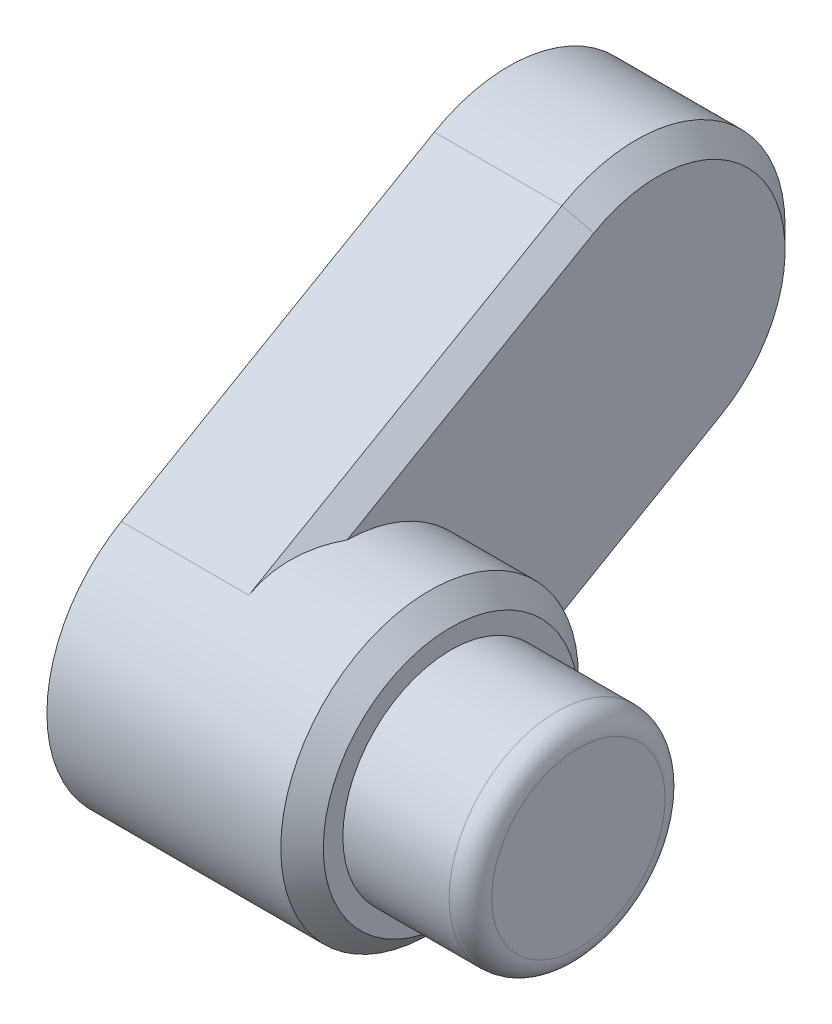
ISO-10303-21;
HEADER;
FILE_DESCRIPTION(('STEP AP214'),'2;1');
FILE_NAME('part.step','',(''),(''),'','','');
FILE_SCHEMA(('AUTOMOTIVE_DESIGN { 1 0 10303 214 1 1 1 1 }'));
ENDSEC;
DATA;
#1=APPLICATION_CONTEXT('core data for automotive mechanical design processes');
#2=APPLICATION_PROTOCOL_DEFINITION('international standard','automotive_design',2000,#1);
#3=PRODUCT_CONTEXT('',#1,'mechanical');
#4=PRODUCT('Part','Part','',(#3));
#5=PRODUCT_RELATED_PRODUCT_CATEGORY('part','',(#4));
#6=PRODUCT_DEFINITION_FORMATION('','',#4);
#7=PRODUCT_DEFINITION_CONTEXT('part definition',#1,'design');
#8=PRODUCT_DEFINITION('design','',#6,#7);
#9=PRODUCT_DEFINITION_SHAPE('','',#8);
#10=(LENGTH_UNIT() NAMED_UNIT(*) SI_UNIT(.MILLI.,.METRE.));
#11=(NAMED_UNIT(*) PLANE_ANGLE_UNIT() SI_UNIT($,.RADIAN.));
#12=(NAMED_UNIT(*) SI_UNIT($,.STERADIAN.) SOLID_ANGLE_UNIT());
#13=UNCERTAINTY_MEASURE_WITH_UNIT(LENGTH_MEASURE(1.E-05),#10,'distance_accuracy_value','');
#14=(GEOMETRIC_REPRESENTATION_CONTEXT(3) GLOBAL_UNCERTAINTY_ASSIGNED_CONTEXT((#13)) GLOBAL_UNIT_ASSIGNED_CONTEXT((#10,
#11,#12)) REPRESENTATION_CONTEXT('',''));
#15=CARTESIAN_POINT('',(0.,0.,0.));
#16=DIRECTION('',(0.,0.,1.));
#17=DIRECTION('',(1.,0.,0.));
#18=AXIS2_PLACEMENT_3D('',#15,#16,#17);
#19=CARTESIAN_POINT('',(120.,0.,0.));
#20=DIRECTION('',(1.,0.,0.));
#21=DIRECTION('',(0.,0.,-1.));
#22=AXIS2_PLACEMENT_3D('',#19,#20,#21);
#23=PLANE('',#22);
#24=CARTESIAN_POINT('',(120.,0.,0.));
#25=DIRECTION('',(1.,0.,0.));
#26=DIRECTION('',(0.,0.,-1.));
#27=AXIS2_PLACEMENT_3D('',#24,#25,#26);
#28=CIRCLE('',#27,60.);
#29=CARTESIAN_POINT('',(120.,0.,60.));
#30=VERTEX_POINT('',#29);
#31=EDGE_CURVE('E162',#30,#30,#28,.T.);
#32=ORIENTED_EDGE('',*,*,#31,.T.);
#33=EDGE_LOOP('',(#32));
#34=FACE_BOUND('',#33,.T.);
#35=CARTESIAN_POINT('',(120.,0.,0.));
#36=DIRECTION('',(1.,0.,0.));
#37=DIRECTION('',(0.,0.,-1.));
#38=AXIS2_PLACEMENT_3D('',#35,#36,#37);
#39=CIRCLE('',#38,50.8);
#40=CARTESIAN_POINT('',(120.,0.,50.8));
#41=VERTEX_POINT('',#40);
#42=EDGE_CURVE('E174',#41,#41,#39,.T.);
#43=ORIENTED_EDGE('',*,*,#42,.F.);
#44=EDGE_LOOP('',(#43));
#45=FACE_BOUND('',#44,.T.);
#46=ADVANCED_FACE('F46',(#34,#45),#23,.T.);
#47=CARTESIAN_POINT('',(180.,0.,0.));
#48=DIRECTION('',(1.,0.,0.));
#49=DIRECTION('',(0.,0.,-1.));
#50=AXIS2_PLACEMENT_3D('',#47,#48,#49);
#51=PLANE('',#50);
#52=CARTESIAN_POINT('',(180.,0.,0.));
#53=DIRECTION('',(1.,0.,0.));
#54=DIRECTION('',(0.,0.,-1.));
#55=AXIS2_PLACEMENT_3D('',#52,#53,#54);
#56=CIRCLE('',#55,40.8);
#57=CARTESIAN_POINT('',(180.,0.,-40.8));
#58=VERTEX_POINT('',#57);
#59=EDGE_CURVE('E145',#58,#58,#56,.T.);
#60=ORIENTED_EDGE('',*,*,#59,.T.);
#61=EDGE_LOOP('',(#60));
#62=FACE_BOUND('',#61,.T.);
#63=ADVANCED_FACE('F240',(#62),#51,.T.);
#64=CARTESIAN_POINT('',(180.,0.,0.));
#65=DIRECTION('',(-1.,0.,0.));
#66=DIRECTION('',(0.,0.,1.));
#67=AXIS2_PLACEMENT_3D('',#64,#65,#66);
#68=CYLINDRICAL_SURFACE('',#67,50.8);
#69=CARTESIAN_POINT('',(170.,0.,0.));
#70=DIRECTION('',(1.,0.,0.));
#71=DIRECTION('',(0.,0.,-1.));
#72=AXIS2_PLACEMENT_3D('',#69,#70,#71);
#73=CIRCLE('',#72,50.8);
#74=CARTESIAN_POINT('',(170.,0.,50.8));
#75=VERTEX_POINT('',#74);
#76=EDGE_CURVE('E148',#75,#75,#73,.F.);
#77=CARTESIAN_POINT('',(170.,0.,50.8));
#78=CARTESIAN_POINT('',(169.479166666667,0.,50.8));
#79=CARTESIAN_POINT('',(168.958333333333,0.,50.8));
#80=CARTESIAN_POINT('',(167.916666666667,0.,50.8));
#81=CARTESIAN_POINT('',(167.395833333333,0.,50.8));
#82=CARTESIAN_POINT('',(166.354166666667,0.,50.8));
#83=CARTESIAN_POINT('',(165.833333333333,0.,50.8));
#84=CARTESIAN_POINT('',(164.791666666667,0.,50.8));
#85=CARTESIAN_POINT('',(164.270833333333,0.,50.8));
#86=CARTESIAN_POINT('',(163.229166666667,0.,50.8));
#87=CARTESIAN_POINT('',(162.708333333333,0.,50.8));
#88=CARTESIAN_POINT('',(161.666666666667,0.,50.8));
#89=CARTESIAN_POINT('',(161.145833333333,0.,50.8));
#90=CARTESIAN_POINT('',(160.104166666667,0.,50.8));
#91=CARTESIAN_POINT('',(159.583333333333,0.,50.8));
#92=CARTESIAN_POINT('',(158.541666666667,0.,50.8));
#93=CARTESIAN_POINT('',(158.020833333333,0.,50.8));
#94=CARTESIAN_POINT('',(156.979166666667,0.,50.8));
#95=CARTESIAN_POINT('',(156.458333333333,0.,50.8));
#96=CARTESIAN_POINT('',(155.416666666667,0.,50.8));
#97=CARTESIAN_POINT('',(154.895833333333,0.,50.8));
#98=CARTESIAN_POINT('',(153.854166666667,0.,50.8));
#99=CARTESIAN_POINT('',(153.333333333333,0.,50.8));
#100=CARTESIAN_POINT('',(152.291666666667,0.,50.8));
#101=CARTESIAN_POINT('',(151.770833333333,0.,50.8));
#102=CARTESIAN_POINT('',(150.729166666667,0.,50.8));
#103=CARTESIAN_POINT('',(150.208333333333,0.,50.8));
#104=CARTESIAN_POINT('',(149.166666666667,0.,50.8));
#105=CARTESIAN_POINT('',(148.645833333333,0.,50.8));
#106=CARTESIAN_POINT('',(147.604166666667,0.,50.8));
#107=CARTESIAN_POINT('',(147.083333333333,0.,50.8));
#108=CARTESIAN_POINT('',(146.041666666667,0.,50.8));
#109=CARTESIAN_POINT('',(145.520833333333,0.,50.8));
#110=CARTESIAN_POINT('',(144.479166666667,0.,50.8));
#111=CARTESIAN_POINT('',(143.958333333333,0.,50.8));
#112=CARTESIAN_POINT('',(142.916666666667,0.,50.8));
#113=CARTESIAN_POINT('',(142.395833333333,0.,50.8));
#114=CARTESIAN_POINT('',(141.354166666667,0.,50.8));
#115=CARTESIAN_POINT('',(140.833333333333,0.,50.8));
#116=CARTESIAN_POINT('',(139.791666666667,0.,50.8));
#117=CARTESIAN_POINT('',(139.270833333333,0.,50.8));
#118=CARTESIAN_POINT('',(138.229166666667,0.,50.8));
#119=CARTESIAN_POINT('',(137.708333333333,0.,50.8));
#120=CARTESIAN_POINT('',(136.666666666667,0.,50.8));
#121=CARTESIAN_POINT('',(136.145833333333,0.,50.8));
#122=CARTESIAN_POINT('',(135.104166666667,0.,50.8));
#123=CARTESIAN_POINT('',(134.583333333333,0.,50.8));
#124=CARTESIAN_POINT('',(133.541666666667,0.,50.8));
#125=CARTESIAN_POINT('',(133.020833333333,0.,50.8));
#126=CARTESIAN_POINT('',(131.979166666667,0.,50.8));
#127=CARTESIAN_POINT('',(131.458333333333,0.,50.8));
#128=CARTESIAN_POINT('',(130.416666666667,0.,50.8));
#129=CARTESIAN_POINT('',(129.895833333333,0.,50.8));
#130=CARTESIAN_POINT('',(128.854166666667,0.,50.8));
#131=CARTESIAN_POINT('',(128.333333333333,0.,50.8));
#132=CARTESIAN_POINT('',(127.291666666667,0.,50.8));
#133=CARTESIAN_POINT('',(126.770833333333,0.,50.8));
#134=CARTESIAN_POINT('',(125.729166666667,0.,50.8));
#135=CARTESIAN_POINT('',(125.208333333333,0.,50.8));
#136=CARTESIAN_POINT('',(124.166666666667,0.,50.8));
#137=CARTESIAN_POINT('',(123.645833333333,0.,50.8));
#138=CARTESIAN_POINT('',(122.604166666667,0.,50.8));
#139=CARTESIAN_POINT('',(122.083333333333,0.,50.8));
#140=CARTESIAN_POINT('',(121.041666666667,0.,50.8));
#141=CARTESIAN_POINT('',(120.520833333333,0.,50.8));
#142=CARTESIAN_POINT('',(120.,0.,50.8));
#143=B_SPLINE_CURVE_WITH_KNOTS('',3,(#77,#78,#79,#80,#81,#82,#83,#84,#85,#86,#87,#88,#89,#90,
#91,#92,#93,#94,#95,#96,#97,#98,#99,#100,#101,#102,#103,#104,#105,#106,#107,#108,#109,#110,#111,
#112,#113,#114,#115,#116,#117,#118,#119,#120,#121,#122,#123,#124,#125,#126,#127,#128,#129,#130,
#131,#132,#133,#134,#135,#136,#137,#138,#139,#140,#141,#142),.UNSPECIFIED.,.F.,.F.,(4,2,2,2,2,2,
2,2,2,2,2,2,2,2,2,2,2,2,2,2,2,2,2,2,2,2,2,2,2,2,2,2,4),(0.,1.56249999999999,3.12499999999999,
4.68749999999998,6.24999999999998,7.81249999999997,9.37499999999999,10.9375,12.5,14.0625,15.625,
17.1875,18.75,20.3125,21.875,23.4375,25.,26.5625,28.125,29.6875,31.25,32.8125,34.375,35.9375,
37.5,39.0625,40.625,42.1875,43.75,45.3125,46.875,48.4375,50.),.UNSPECIFIED.);
#144=EDGE_CURVE('BSEAM247',#75,#41,#143,.T.);
#145=ORIENTED_EDGE('',*,*,#76,.T.);
#146=ORIENTED_EDGE('',*,*,#42,.T.);
#147=ORIENTED_EDGE('',*,*,#144,.T.);
#148=ORIENTED_EDGE('',*,*,#144,.F.);
#149=EDGE_LOOP('',(#145,#147,#146,#148));
#150=FACE_BOUND('',#149,.T.);
#151=ADVANCED_FACE('F247',(#150),#68,.T.);
#152=CARTESIAN_POINT('',(0.,0.,0.));
#153=DIRECTION('',(1.,0.,0.));
#154=DIRECTION('',(0.,0.,-1.));
#155=AXIS2_PLACEMENT_3D('',#152,#153,#154);
#156=PLANE('',#155);
#157=CARTESIAN_POINT('',(0.,0.,0.));
#158=DIRECTION('',(1.,0.,0.));
#159=DIRECTION('',(0.,0.,-1.));
#160=AXIS2_PLACEMENT_3D('',#157,#158,#159);
#161=CIRCLE('',#160,70.);
#162=CARTESIAN_POINT('',(0.,60.6217782649107,35.0000000000001));
#163=VERTEX_POINT('',#162);
#164=CARTESIAN_POINT('',(0.,-60.6217782649107,-35.0000000000001));
#165=VERTEX_POINT('',#164);
#166=EDGE_CURVE('E119',#163,#165,#161,.T.);
#167=ORIENTED_EDGE('',*,*,#166,.F.);
#168=DIRECTION('',(0.,0.500000000000001,-0.866025403784438));
#169=VECTOR('',#168,1.);
#170=CARTESIAN_POINT('',(0.,60.6217782649107,35.0000000000001));
#171=LINE('',#170,#169);
#172=CARTESIAN_POINT('',(0.,145.621778264911,-112.224318643354));
#173=VERTEX_POINT('',#172);
#174=EDGE_CURVE('E134',#163,#173,#171,.T.);
#175=ORIENTED_EDGE('',*,*,#174,.T.);
#176=CARTESIAN_POINT('',(0.,85.0000000000002,-147.224318643354));
#177=DIRECTION('',(1.,0.,0.));
#178=DIRECTION('',(0.,0.,-1.));
#179=AXIS2_PLACEMENT_3D('',#176,#177,#178);
#180=CIRCLE('',#179,70.0000000000001);
#181=CARTESIAN_POINT('',(0.,24.3782217350895,-182.224318643355));
#182=VERTEX_POINT('',#181);
#183=EDGE_CURVE('E122',#182,#173,#180,.T.);
#184=ORIENTED_EDGE('',*,*,#183,.F.);
#185=DIRECTION('',(0.,0.500000000000001,-0.866025403784438));
#186=VECTOR('',#185,1.);
#187=CARTESIAN_POINT('',(0.,-60.6217782649107,-35.0000000000001));
#188=LINE('',#187,#186);
#189=EDGE_CURVE('E106',#165,#182,#188,.T.);
#190=ORIENTED_EDGE('',*,*,#189,.F.);
#191=EDGE_LOOP('',(#167,#175,#184,#190));
#192=FACE_BOUND('',#191,.T.);
#193=ADVANCED_FACE('F117',(#192),#156,.F.);
#194=CARTESIAN_POINT('',(70.,85.0000000000002,-147.224318643354));
#195=DIRECTION('',(-1.,0.,0.));
#196=DIRECTION('',(0.,0.,1.));
#197=AXIS2_PLACEMENT_3D('',#194,#195,#196);
#198=CYLINDRICAL_SURFACE('',#197,70.0000000000001);
#199=DIRECTION('',(-1.,0.,0.));
#200=VECTOR('',#199,1.);
#201=CARTESIAN_POINT('',(70.,145.621778264911,-112.224318643354));
#202=LINE('',#201,#200);
#203=CARTESIAN_POINT('',(60.,145.621778264911,-112.224318643354));
#204=VERTEX_POINT('',#203);
#205=EDGE_CURVE('E137',#204,#173,#202,.T.);
#206=ORIENTED_EDGE('',*,*,#205,.F.);
#207=CARTESIAN_POINT('',(60.,85.0000000000002,-147.224318643354));
#208=DIRECTION('',(1.,0.,0.));
#209=DIRECTION('',(0.,0.,-1.));
#210=AXIS2_PLACEMENT_3D('',#207,#208,#209);
#211=CIRCLE('',#210,70.0000000000001);
#212=CARTESIAN_POINT('',(60.,24.3782217350895,-182.224318643355));
#213=VERTEX_POINT('',#212);
#214=EDGE_CURVE('E159',#204,#213,#211,.F.);
#215=ORIENTED_EDGE('',*,*,#214,.T.);
#216=DIRECTION('',(-1.,0.,0.));
#217=VECTOR('',#216,1.);
#218=CARTESIAN_POINT('',(70.,24.3782217350895,-182.224318643355));
#219=LINE('',#218,#217);
#220=EDGE_CURVE('E113',#213,#182,#219,.T.);
#221=ORIENTED_EDGE('',*,*,#220,.T.);
#222=ORIENTED_EDGE('',*,*,#183,.T.);
#223=EDGE_LOOP('',(#206,#215,#221,#222));
#224=FACE_BOUND('',#223,.T.);
#225=ADVANCED_FACE('F257',(#224),#198,.T.);
#226=CARTESIAN_POINT('',(70.,-60.6217782649107,-35.0000000000001));
#227=DIRECTION('',(0.,0.866025403784438,0.500000000000001));
#228=DIRECTION('',(0.,-0.500000000000001,0.866025403784438));
#229=AXIS2_PLACEMENT_3D('',#226,#227,#228);
#230=PLANE('',#229);
#231=ORIENTED_EDGE('',*,*,#220,.F.);
#232=DIRECTION('',(0.,-0.500000000000001,0.866025403784438));
#233=VECTOR('',#232,1.);
#234=CARTESIAN_POINT('',(60.,-60.6217782649107,-35.0000000000001));
#235=LINE('',#234,#233);
#236=CARTESIAN_POINT('',(60.,-60.6217782649107,-35.0000000000001));
#237=VERTEX_POINT('',#236);
#238=EDGE_CURVE('E109',#213,#237,#235,.T.);
#239=ORIENTED_EDGE('',*,*,#238,.T.);
#240=DIRECTION('',(-1.,0.,0.));
#241=VECTOR('',#240,1.);
#242=CARTESIAN_POINT('',(70.,-60.6217782649107,-35.0000000000001));
#243=LINE('',#242,#241);
#244=EDGE_CURVE('E102',#237,#165,#243,.T.);
#245=ORIENTED_EDGE('',*,*,#244,.T.);
#246=ORIENTED_EDGE('',*,*,#189,.T.);
#247=EDGE_LOOP('',(#231,#239,#245,#246));
#248=FACE_BOUND('',#247,.T.);
#249=ADVANCED_FACE('F105',(#248),#230,.F.);
#250=CARTESIAN_POINT('',(70.,0.,0.));
#251=DIRECTION('',(-1.,0.,0.));
#252=DIRECTION('',(0.,0.,1.));
#253=AXIS2_PLACEMENT_3D('',#250,#251,#252);
#254=CYLINDRICAL_SURFACE('',#253,70.);
#255=CARTESIAN_POINT('',(110.,0.,0.));
#256=DIRECTION('',(1.,0.,0.));
#257=DIRECTION('',(0.,0.,-1.));
#258=AXIS2_PLACEMENT_3D('',#255,#256,#257);
#259=CIRCLE('',#258,70.);
#260=CARTESIAN_POINT('',(110.,0.,70.));
#261=VERTEX_POINT('',#260);
#262=EDGE_CURVE('E165',#261,#261,#259,.F.);
#263=ORIENTED_EDGE('',*,*,#262,.T.);
#264=EDGE_LOOP('',(#263));
#265=FACE_BOUND('',#264,.T.);
#266=ORIENTED_EDGE('',*,*,#166,.T.);
#267=ORIENTED_EDGE('',*,*,#244,.F.);
#268=CARTESIAN_POINT('',(130.,0.,0.));
#269=DIRECTION('',(0.70710678118655,-0.612372435695792,-0.353553390593273));
#270=DIRECTION('',(-0.707106781186545,-0.612372435695796,-0.353553390593276));
#271=AXIS2_PLACEMENT_3D('',#268,#269,#270);
#272=ELLIPSE('',#271,98.9949493661164,70.);
#273=CARTESIAN_POINT('',(70.,-33.9337678497463,-61.2249899919921));
#274=VERTEX_POINT('',#273);
#275=EDGE_CURVE('E57',#237,#274,#272,.T.);
#276=ORIENTED_EDGE('',*,*,#275,.T.);
#277=CARTESIAN_POINT('',(70.,0.,0.));
#278=DIRECTION('',(1.,0.,0.));
#279=DIRECTION('',(0.,0.,-1.));
#280=AXIS2_PLACEMENT_3D('',#277,#278,#279);
#281=CIRCLE('',#280,70.);
#282=CARTESIAN_POINT('',(70.,69.9892806043863,-1.22498999199201));
#283=VERTEX_POINT('',#282);
#284=EDGE_CURVE('E142',#283,#274,#281,.F.);
#285=ORIENTED_EDGE('',*,*,#284,.F.);
#286=CARTESIAN_POINT('',(130.,0.,0.));
#287=DIRECTION('',(-0.707106781186549,-0.612372435695792,-0.353553390593274));
#288=DIRECTION('',(-0.707106781186546,0.612372435695796,0.353553390593276));
#289=AXIS2_PLACEMENT_3D('',#286,#287,#288);
#290=ELLIPSE('',#289,98.9949493661164,70.);
#291=CARTESIAN_POINT('',(60.,60.6217782649107,35.0000000000001));
#292=VERTEX_POINT('',#291);
#293=EDGE_CURVE('E11',#283,#292,#290,.F.);
#294=ORIENTED_EDGE('',*,*,#293,.T.);
#295=DIRECTION('',(-1.,0.,0.));
#296=VECTOR('',#295,1.);
#297=CARTESIAN_POINT('',(70.,60.6217782649107,35.0000000000001));
#298=LINE('',#297,#296);
#299=EDGE_CURVE('E125',#292,#163,#298,.T.);
#300=ORIENTED_EDGE('',*,*,#299,.T.);
#301=EDGE_LOOP('',(#266,#267,#276,#285,#294,#300));
#302=FACE_BOUND('',#301,.T.);
#303=ADVANCED_FACE('F124',(#265,#302),#254,.T.);
#304=CARTESIAN_POINT('',(70.,60.6217782649107,35.0000000000001));
#305=DIRECTION('',(0.,0.866025403784438,0.500000000000001));
#306=DIRECTION('',(0.,-0.500000000000001,0.866025403784438));
#307=AXIS2_PLACEMENT_3D('',#304,#305,#306);
#308=PLANE('',#307);
#309=ORIENTED_EDGE('',*,*,#299,.F.);
#310=DIRECTION('',(0.,0.500000000000001,-0.866025403784438));
#311=VECTOR('',#310,1.);
#312=CARTESIAN_POINT('',(60.,60.6217782649107,35.0000000000001));
#313=LINE('',#312,#311);
#314=EDGE_CURVE('E70',#292,#204,#313,.T.);
#315=ORIENTED_EDGE('',*,*,#314,.T.);
#316=ORIENTED_EDGE('',*,*,#205,.T.);
#317=ORIENTED_EDGE('',*,*,#174,.F.);
#318=EDGE_LOOP('',(#309,#315,#316,#317));
#319=FACE_BOUND('',#318,.T.);
#320=ADVANCED_FACE('F228',(#319),#308,.T.);
#321=CARTESIAN_POINT('',(70.,0.,0.));
#322=DIRECTION('',(1.,0.,0.));
#323=DIRECTION('',(0.,0.,-1.));
#324=AXIS2_PLACEMENT_3D('',#321,#322,#323);
#325=PLANE('',#324);
#326=ORIENTED_EDGE('',*,*,#284,.T.);
#327=DIRECTION('',(0.,0.500000000000001,-0.866025403784438));
#328=VECTOR('',#327,1.);
#329=CARTESIAN_POINT('',(70.,33.0384757729339,-177.224318643355));
#330=LINE('',#329,#328);
#331=CARTESIAN_POINT('',(70.,33.0384757729339,-177.224318643355));
#332=VERTEX_POINT('',#331);
#333=EDGE_CURVE('E155',#274,#332,#330,.T.);
#334=ORIENTED_EDGE('',*,*,#333,.T.);
#335=CARTESIAN_POINT('',(70.,85.0000000000002,-147.224318643354));
#336=DIRECTION('',(1.,0.,0.));
#337=DIRECTION('',(0.,0.,-1.));
#338=AXIS2_PLACEMENT_3D('',#335,#336,#337);
#339=CIRCLE('',#338,60.);
#340=CARTESIAN_POINT('',(70.,136.961524227067,-117.224318643354));
#341=VERTEX_POINT('',#340);
#342=EDGE_CURVE('E153',#332,#341,#339,.T.);
#343=ORIENTED_EDGE('',*,*,#342,.T.);
#344=DIRECTION('',(0.,-0.500000000000001,0.866025403784438));
#345=VECTOR('',#344,1.);
#346=CARTESIAN_POINT('',(70.,51.9615242270662,30.0000000000001));
#347=LINE('',#346,#345);
#348=EDGE_CURVE('E151',#341,#283,#347,.T.);
#349=ORIENTED_EDGE('',*,*,#348,.T.);
#350=EDGE_LOOP('',(#326,#334,#343,#349));
#351=FACE_BOUND('',#350,.T.);
#352=ADVANCED_FACE('F216',(#351),#325,.T.);
#353=CARTESIAN_POINT('',(170.,0.,0.));
#354=DIRECTION('',(1.,0.,0.));
#355=DIRECTION('',(0.,0.,-1.));
#356=AXIS2_PLACEMENT_3D('',#353,#354,#355);
#357=TOROIDAL_SURFACE('',#356,40.8,10.);
#358=ORIENTED_EDGE('',*,*,#76,.F.);
#359=EDGE_LOOP('',(#358));
#360=FACE_BOUND('',#359,.T.);
#361=ORIENTED_EDGE('',*,*,#59,.F.);
#362=EDGE_LOOP('',(#361));
#363=FACE_BOUND('',#362,.T.);
#364=ADVANCED_FACE('F227',(#360,#363),#357,.T.);
#365=CARTESIAN_POINT('',(60.,60.6217782649107,35.0000000000001));
#366=DIRECTION('',(-0.707106781186549,-0.612372435695792,-0.353553390593274));
#367=DIRECTION('',(0.,0.500000000000001,-0.866025403784438));
#368=AXIS2_PLACEMENT_3D('',#365,#366,#367);
#369=PLANE('',#368);
#370=ORIENTED_EDGE('',*,*,#293,.F.);
#371=ORIENTED_EDGE('',*,*,#348,.F.);
#372=DIRECTION('',(0.707106781186547,-0.612372435695794,-0.353553390593276));
#373=VECTOR('',#372,1.);
#374=CARTESIAN_POINT('',(60.,145.621778264911,-112.224318643354));
#375=LINE('',#374,#373);
#376=EDGE_CURVE('E51',#204,#341,#375,.T.);
#377=ORIENTED_EDGE('',*,*,#376,.F.);
#378=ORIENTED_EDGE('',*,*,#314,.F.);
#379=EDGE_LOOP('',(#370,#371,#377,#378));
#380=FACE_BOUND('',#379,.T.);
#381=ADVANCED_FACE('F235',(#380),#369,.F.);
#382=CARTESIAN_POINT('',(70.,85.0000000000002,-147.224318643354));
#383=DIRECTION('',(-1.,0.,0.));
#384=DIRECTION('',(0.,0.,1.));
#385=AXIS2_PLACEMENT_3D('',#382,#383,#384);
#386=CONICAL_SURFACE('',#385,60.,0.785398163397451);
#387=ORIENTED_EDGE('',*,*,#376,.T.);
#388=ORIENTED_EDGE('',*,*,#342,.F.);
#389=DIRECTION('',(0.707106781186546,0.612372435695796,0.353553390593275));
#390=VECTOR('',#389,1.);
#391=CARTESIAN_POINT('',(60.,24.3782217350895,-182.224318643355));
#392=LINE('',#391,#390);
#393=EDGE_CURVE('E168',#213,#332,#392,.T.);
#394=ORIENTED_EDGE('',*,*,#393,.F.);
#395=ORIENTED_EDGE('',*,*,#214,.F.);
#396=EDGE_LOOP('',(#387,#388,#394,#395));
#397=FACE_BOUND('',#396,.T.);
#398=ADVANCED_FACE('F278',(#397),#386,.T.);
#399=CARTESIAN_POINT('',(70.,-51.9615242270663,-30.0000000000001));
#400=DIRECTION('',(0.70710678118655,-0.612372435695792,-0.353553390593273));
#401=DIRECTION('',(0.,-0.500000000000001,0.866025403784438));
#402=AXIS2_PLACEMENT_3D('',#399,#400,#401);
#403=PLANE('',#402);
#404=ORIENTED_EDGE('',*,*,#275,.F.);
#405=ORIENTED_EDGE('',*,*,#238,.F.);
#406=ORIENTED_EDGE('',*,*,#393,.T.);
#407=ORIENTED_EDGE('',*,*,#333,.F.);
#408=EDGE_LOOP('',(#404,#405,#406,#407));
#409=FACE_BOUND('',#408,.T.);
#410=ADVANCED_FACE('F272',(#409),#403,.T.);
#411=CARTESIAN_POINT('',(120.,0.,0.));
#412=DIRECTION('',(-1.,0.,0.));
#413=DIRECTION('',(0.,0.,1.));
#414=AXIS2_PLACEMENT_3D('',#411,#412,#413);
#415=CONICAL_SURFACE('',#414,60.,0.785398163397445);
#416=CARTESIAN_POINT('',(110.,0.,70.));
#417=CARTESIAN_POINT('',(110.104166666667,0.,69.8958333333334));
#418=CARTESIAN_POINT('',(110.208333333333,0.,69.7916666666667));
#419=CARTESIAN_POINT('',(110.416666666667,0.,69.5833333333334));
#420=CARTESIAN_POINT('',(110.520833333333,0.,69.4791666666667));
#421=CARTESIAN_POINT('',(110.729166666667,0.,69.2708333333334));
#422=CARTESIAN_POINT('',(110.833333333333,0.,69.1666666666667));
#423=CARTESIAN_POINT('',(111.041666666667,0.,68.9583333333334));
#424=CARTESIAN_POINT('',(111.145833333333,0.,68.8541666666667));
#425=CARTESIAN_POINT('',(111.354166666667,0.,68.6458333333334));
#426=CARTESIAN_POINT('',(111.458333333333,0.,68.5416666666667));
#427=CARTESIAN_POINT('',(111.666666666667,0.,68.3333333333334));
#428=CARTESIAN_POINT('',(111.770833333333,0.,68.2291666666667));
#429=CARTESIAN_POINT('',(111.979166666667,0.,68.0208333333334));
#430=CARTESIAN_POINT('',(112.083333333333,0.,67.9166666666667));
#431=CARTESIAN_POINT('',(112.291666666667,0.,67.7083333333334));
#432=CARTESIAN_POINT('',(112.395833333333,0.,67.6041666666667));
#433=CARTESIAN_POINT('',(112.604166666667,0.,67.3958333333334));
#434=CARTESIAN_POINT('',(112.708333333333,0.,67.2916666666667));
#435=CARTESIAN_POINT('',(112.916666666667,0.,67.0833333333334));
#436=CARTESIAN_POINT('',(113.020833333333,0.,66.9791666666667));
#437=CARTESIAN_POINT('',(113.229166666667,0.,66.7708333333334));
#438=CARTESIAN_POINT('',(113.333333333333,0.,66.6666666666667));
#439=CARTESIAN_POINT('',(113.541666666667,0.,66.4583333333334));
#440=CARTESIAN_POINT('',(113.645833333333,0.,66.3541666666667));
#441=CARTESIAN_POINT('',(113.854166666667,0.,66.1458333333334));
#442=CARTESIAN_POINT('',(113.958333333333,0.,66.0416666666667));
#443=CARTESIAN_POINT('',(114.166666666667,0.,65.8333333333334));
#444=CARTESIAN_POINT('',(114.270833333333,0.,65.7291666666667));
#445=CARTESIAN_POINT('',(114.479166666667,0.,65.5208333333334));
#446=CARTESIAN_POINT('',(114.583333333333,0.,65.4166666666667));
#447=CARTESIAN_POINT('',(114.791666666667,0.,65.2083333333334));
#448=CARTESIAN_POINT('',(114.895833333333,0.,65.1041666666667));
#449=CARTESIAN_POINT('',(115.104166666667,0.,64.8958333333334));
#450=CARTESIAN_POINT('',(115.208333333333,0.,64.7916666666667));
#451=CARTESIAN_POINT('',(115.416666666667,0.,64.5833333333334));
#452=CARTESIAN_POINT('',(115.520833333333,0.,64.4791666666667));
#453=CARTESIAN_POINT('',(115.729166666667,0.,64.2708333333333));
#454=CARTESIAN_POINT('',(115.833333333333,0.,64.1666666666667));
#455=CARTESIAN_POINT('',(116.041666666667,0.,63.9583333333333));
#456=CARTESIAN_POINT('',(116.145833333333,0.,63.8541666666667));
#457=CARTESIAN_POINT('',(116.354166666667,0.,63.6458333333333));
#458=CARTESIAN_POINT('',(116.458333333333,0.,63.5416666666667));
#459=CARTESIAN_POINT('',(116.666666666667,0.,63.3333333333333));
#460=CARTESIAN_POINT('',(116.770833333333,0.,63.2291666666667));
#461=CARTESIAN_POINT('',(116.979166666667,0.,63.0208333333333));
#462=CARTESIAN_POINT('',(117.083333333333,0.,62.9166666666667));
#463=CARTESIAN_POINT('',(117.291666666667,0.,62.7083333333333));
#464=CARTESIAN_POINT('',(117.395833333333,0.,62.6041666666667));
#465=CARTESIAN_POINT('',(117.604166666667,0.,62.3958333333333));
#466=CARTESIAN_POINT('',(117.708333333333,0.,62.2916666666667));
#467=CARTESIAN_POINT('',(117.916666666667,0.,62.0833333333333));
#468=CARTESIAN_POINT('',(118.020833333333,0.,61.9791666666667));
#469=CARTESIAN_POINT('',(118.229166666667,0.,61.7708333333333));
#470=CARTESIAN_POINT('',(118.333333333333,0.,61.6666666666667));
#471=CARTESIAN_POINT('',(118.541666666667,0.,61.4583333333333));
#472=CARTESIAN_POINT('',(118.645833333333,0.,61.3541666666667));
#473=CARTESIAN_POINT('',(118.854166666667,0.,61.1458333333333));
#474=CARTESIAN_POINT('',(118.958333333333,0.,61.0416666666667));
#475=CARTESIAN_POINT('',(119.166666666667,0.,60.8333333333333));
#476=CARTESIAN_POINT('',(119.270833333333,0.,60.7291666666667));
#477=CARTESIAN_POINT('',(119.479166666667,0.,60.5208333333333));
#478=CARTESIAN_POINT('',(119.583333333333,0.,60.4166666666667));
#479=CARTESIAN_POINT('',(119.791666666667,0.,60.2083333333333));
#480=CARTESIAN_POINT('',(119.895833333333,0.,60.1041666666667));
#481=CARTESIAN_POINT('',(120.,0.,60.));
#482=B_SPLINE_CURVE_WITH_KNOTS('',3,(#416,#417,#418,#419,#420,#421,#422,#423,#424,#425,#426,
#427,#428,#429,#430,#431,#432,#433,#434,#435,#436,#437,#438,#439,#440,#441,#442,#443,#444,#445,
#446,#447,#448,#449,#450,#451,#452,#453,#454,#455,#456,#457,#458,#459,#460,#461,#462,#463,#464,
#465,#466,#467,#468,#469,#470,#471,#472,#473,#474,#475,#476,#477,#478,#479,#480,#481),
.UNSPECIFIED.,.F.,.F.,(4,2,2,2,2,2,2,2,2,2,2,2,2,2,2,2,2,2,2,2,2,2,2,2,2,2,2,2,2,2,2,2,4),(0.,
0.441941738241602,0.883883476483195,1.3258252147248,1.76776695296639,2.20970869120798,
2.65165042944958,3.09359216769117,3.53553390593277,3.97747564417436,4.41941738241597,
4.86135912065756,5.30330085889915,5.74524259714075,6.18718433538235,6.62912607362394,
7.07106781186553,7.51300955010713,7.95495128834872,8.39689302659032,8.83883476483192,
9.28077650307351,9.72271824131511,10.1646599795567,10.6066017177983,11.0485434560399,
11.4904851942815,11.9324269325231,12.3743686707647,12.8163104090063,13.2582521472479,
13.7001938854895,14.1421356237311),.UNSPECIFIED.);
#483=EDGE_CURVE('BSEAM49',#261,#30,#482,.T.);
#484=ORIENTED_EDGE('',*,*,#262,.F.);
#485=ORIENTED_EDGE('',*,*,#31,.F.);
#486=ORIENTED_EDGE('',*,*,#483,.T.);
#487=ORIENTED_EDGE('',*,*,#483,.F.);
#488=EDGE_LOOP('',(#484,#486,#485,#487));
#489=FACE_BOUND('',#488,.T.);
#490=ADVANCED_FACE('F49',(#489),#415,.T.);
#491=CLOSED_SHELL('',(#46,#63,#151,#193,#225,#249,#303,#320,#352,#364,#381,#398,#410,#490));
#492=CARTESIAN_POINT('',(70.,0.,0.));
#493=DIRECTION('',(1.,0.,0.));
#494=DIRECTION('',(0.,0.,-1.));
#495=AXIS2_PLACEMENT_3D('',#492,#493,#494);
#496=CIRCLE('',#495,12.7);
#497=CARTESIAN_POINT('',(70.,0.,-12.7));
#498=VERTEX_POINT('',#497);
#499=EDGE_CURVE('E129',#498,#498,#496,.T.);
#500=ORIENTED_EDGE('',*,*,#499,.F.);
#501=EDGE_LOOP('',(#500));
#502=FACE_BOUND('',#501,.T.);
#503=CARTESIAN_POINT('',(70.,0.,0.));
#504=DIRECTION('',(1.,0.,0.));
#505=DIRECTION('',(0.,0.,-1.));
#506=AXIS2_PLACEMENT_3D('',#503,#504,#505);
#507=CIRCLE('',#506,50.8);
#508=CARTESIAN_POINT('',(70.,0.,-50.8));
#509=VERTEX_POINT('',#508);
#510=EDGE_CURVE('E112',#509,#509,#507,.F.);
#511=ORIENTED_EDGE('',*,*,#510,.F.);
#512=EDGE_LOOP('',(#511));
#513=FACE_BOUND('',#512,.T.);
#514=ADVANCED_FACE('F211',(#502,#513),#325,.T.);
#515=CARTESIAN_POINT('',(80.,0.,0.));
#516=DIRECTION('',(-1.,0.,0.));
#517=DIRECTION('',(0.,0.,1.));
#518=AXIS2_PLACEMENT_3D('',#515,#516,#517);
#519=CYLINDRICAL_SURFACE('',#518,12.7);
#520=CARTESIAN_POINT('',(80.,0.,0.));
#521=DIRECTION('',(1.,0.,0.));
#522=DIRECTION('',(0.,0.,-1.));
#523=AXIS2_PLACEMENT_3D('',#520,#521,#522);
#524=CIRCLE('',#523,12.7);
#525=CARTESIAN_POINT('',(80.,0.,-12.7));
#526=VERTEX_POINT('',#525);
#527=EDGE_CURVE('E126',#526,#526,#524,.T.);
#528=ORIENTED_EDGE('',*,*,#527,.F.);
#529=EDGE_LOOP('',(#528));
#530=FACE_BOUND('',#529,.T.);
#531=ORIENTED_EDGE('',*,*,#499,.T.);
#532=EDGE_LOOP('',(#531));
#533=FACE_BOUND('',#532,.T.);
#534=ADVANCED_FACE('F208',(#530,#533),#519,.T.);
#535=CARTESIAN_POINT('',(90.,0.,0.));
#536=DIRECTION('',(-1.,0.,0.));
#537=DIRECTION('',(0.,0.,1.));
#538=AXIS2_PLACEMENT_3D('',#535,#536,#537);
#539=CYLINDRICAL_SURFACE('',#538,25.4);
#540=CARTESIAN_POINT('',(90.,0.,0.));
#541=DIRECTION('',(1.,0.,0.));
#542=DIRECTION('',(0.,0.,-1.));
#543=AXIS2_PLACEMENT_3D('',#540,#541,#542);
#544=CIRCLE('',#543,25.4);
#545=CARTESIAN_POINT('',(90.,0.,-25.4));
#546=VERTEX_POINT('',#545);
#547=EDGE_CURVE('E187',#546,#546,#544,.T.);
#548=ORIENTED_EDGE('',*,*,#547,.F.);
#549=EDGE_LOOP('',(#548));
#550=FACE_BOUND('',#549,.T.);
#551=CARTESIAN_POINT('',(80.,0.,0.));
#552=DIRECTION('',(1.,0.,0.));
#553=DIRECTION('',(0.,0.,-1.));
#554=AXIS2_PLACEMENT_3D('',#551,#552,#553);
#555=CIRCLE('',#554,25.4);
#556=CARTESIAN_POINT('',(80.,0.,-25.4));
#557=VERTEX_POINT('',#556);
#558=EDGE_CURVE('E184',#557,#557,#555,.T.);
#559=ORIENTED_EDGE('',*,*,#558,.T.);
#560=EDGE_LOOP('',(#559));
#561=FACE_BOUND('',#560,.T.);
#562=ADVANCED_FACE('F193',(#550,#561),#539,.T.);
#563=CARTESIAN_POINT('',(80.,0.,0.));
#564=DIRECTION('',(1.,0.,0.));
#565=DIRECTION('',(0.,0.,-1.));
#566=AXIS2_PLACEMENT_3D('',#563,#564,#565);
#567=PLANE('',#566);
#568=ORIENTED_EDGE('',*,*,#527,.T.);
#569=EDGE_LOOP('',(#568));
#570=FACE_BOUND('',#569,.T.);
#571=ORIENTED_EDGE('',*,*,#558,.F.);
#572=EDGE_LOOP('',(#571));
#573=FACE_BOUND('',#572,.T.);
#574=ADVANCED_FACE('F195',(#570,#573),#567,.F.);
#575=CARTESIAN_POINT('',(90.,0.,0.));
#576=DIRECTION('',(1.,0.,0.));
#577=DIRECTION('',(0.,0.,-1.));
#578=AXIS2_PLACEMENT_3D('',#575,#576,#577);
#579=PLANE('',#578);
#580=ORIENTED_EDGE('',*,*,#547,.T.);
#581=EDGE_LOOP('',(#580));
#582=FACE_BOUND('',#581,.T.);
#583=CARTESIAN_POINT('',(90.,0.,0.));
#584=DIRECTION('',(1.,0.,0.));
#585=DIRECTION('',(0.,0.,-1.));
#586=AXIS2_PLACEMENT_3D('',#583,#584,#585);
#587=CIRCLE('',#586,50.8);
#588=CARTESIAN_POINT('',(90.,0.,-50.8));
#589=VERTEX_POINT('',#588);
#590=EDGE_CURVE('E179',#589,#589,#587,.T.);
#591=ORIENTED_EDGE('',*,*,#590,.F.);
#592=EDGE_LOOP('',(#591));
#593=FACE_BOUND('',#592,.T.);
#594=ADVANCED_FACE('F197',(#582,#593),#579,.F.);
#595=CARTESIAN_POINT('',(120.,0.,0.));
#596=DIRECTION('',(-1.,0.,0.));
#597=DIRECTION('',(0.,0.,1.));
#598=AXIS2_PLACEMENT_3D('',#595,#596,#597);
#599=CYLINDRICAL_SURFACE('',#598,50.8);
#600=ORIENTED_EDGE('',*,*,#510,.T.);
#601=EDGE_LOOP('',(#600));
#602=FACE_BOUND('',#601,.T.);
#603=ORIENTED_EDGE('',*,*,#590,.T.);
#604=EDGE_LOOP('',(#603));
#605=FACE_BOUND('',#604,.T.);
#606=ADVANCED_FACE('F205',(#602,#605),#599,.F.);
#607=CLOSED_SHELL('',(#514,#534,#562,#574,#594,#606));
#608=ORIENTED_CLOSED_SHELL('',*,#607,.T.);
#609=BREP_WITH_VOIDS('B2',#491,(#608));
#610=ADVANCED_BREP_SHAPE_REPRESENTATION('',(#18,#609),#14);
#611=SHAPE_DEFINITION_REPRESENTATION(#9,#610);
ENDSEC;
END-ISO-10303-21;
